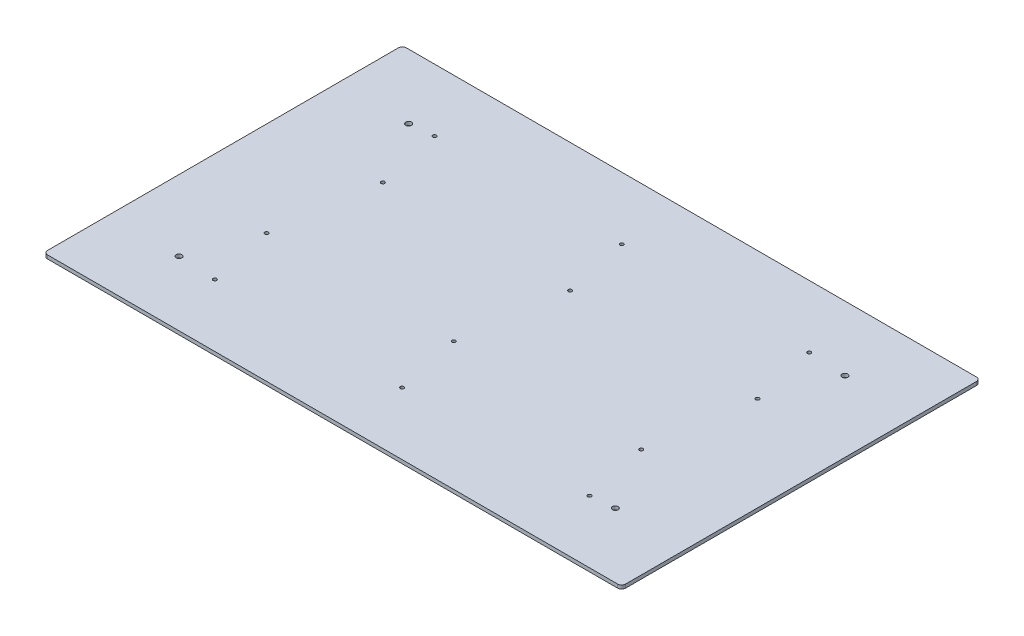
ISO-10303-21;
HEADER;
FILE_DESCRIPTION(('STEP AP214'),'2;1');
FILE_NAME('part.step','',(''),(''),'','','');
FILE_SCHEMA(('AUTOMOTIVE_DESIGN { 1 0 10303 214 1 1 1 1 }'));
ENDSEC;
DATA;
#1=APPLICATION_CONTEXT('core data for automotive mechanical design processes');
#2=APPLICATION_PROTOCOL_DEFINITION('international standard','automotive_design',2000,#1);
#3=PRODUCT_CONTEXT('',#1,'mechanical');
#4=PRODUCT('Part','Part','',(#3));
#5=PRODUCT_RELATED_PRODUCT_CATEGORY('part','',(#4));
#6=PRODUCT_DEFINITION_FORMATION('','',#4);
#7=PRODUCT_DEFINITION_CONTEXT('part definition',#1,'design');
#8=PRODUCT_DEFINITION('design','',#6,#7);
#9=PRODUCT_DEFINITION_SHAPE('','',#8);
#10=(LENGTH_UNIT() NAMED_UNIT(*) SI_UNIT(.MILLI.,.METRE.));
#11=(NAMED_UNIT(*) PLANE_ANGLE_UNIT() SI_UNIT($,.RADIAN.));
#12=(NAMED_UNIT(*) SI_UNIT($,.STERADIAN.) SOLID_ANGLE_UNIT());
#13=UNCERTAINTY_MEASURE_WITH_UNIT(LENGTH_MEASURE(1.E-05),#10,'distance_accuracy_value','');
#14=(GEOMETRIC_REPRESENTATION_CONTEXT(3) GLOBAL_UNCERTAINTY_ASSIGNED_CONTEXT((#13)) GLOBAL_UNIT_ASSIGNED_CONTEXT((#10,
#11,#12)) REPRESENTATION_CONTEXT('',''));
#15=CARTESIAN_POINT('',(0.,0.,0.));
#16=DIRECTION('',(0.,0.,1.));
#17=DIRECTION('',(1.,0.,0.));
#18=AXIS2_PLACEMENT_3D('',#15,#16,#17);
#19=CARTESIAN_POINT('',(184.15,2.286,114.3));
#20=DIRECTION('',(-1.,0.,0.));
#21=DIRECTION('',(0.,0.,1.));
#22=AXIS2_PLACEMENT_3D('',#19,#20,#21);
#23=PLANE('',#22);
#24=DIRECTION('',(0.,0.,-1.));
#25=VECTOR('',#24,1.);
#26=CARTESIAN_POINT('',(184.15,0.,114.3));
#27=LINE('',#26,#25);
#28=CARTESIAN_POINT('',(184.15,0.,111.76));
#29=VERTEX_POINT('',#28);
#30=CARTESIAN_POINT('',(184.15,0.,-111.76));
#31=VERTEX_POINT('',#30);
#32=EDGE_CURVE('E126',#29,#31,#27,.T.);
#33=ORIENTED_EDGE('',*,*,#32,.T.);
#34=DIRECTION('',(0.,-1.,0.));
#35=VECTOR('',#34,1.);
#36=CARTESIAN_POINT('',(184.15,2.286,-111.76));
#37=LINE('',#36,#35);
#38=CARTESIAN_POINT('',(184.15,2.286,-111.76));
#39=VERTEX_POINT('',#38);
#40=EDGE_CURVE('E104',#31,#39,#37,.F.);
#41=ORIENTED_EDGE('',*,*,#40,.T.);
#42=DIRECTION('',(0.,0.,-1.));
#43=VECTOR('',#42,1.);
#44=CARTESIAN_POINT('',(184.15,2.286,114.3));
#45=LINE('',#44,#43);
#46=CARTESIAN_POINT('',(184.15,2.286,111.76));
#47=VERTEX_POINT('',#46);
#48=EDGE_CURVE('E136',#47,#39,#45,.T.);
#49=ORIENTED_EDGE('',*,*,#48,.F.);
#50=DIRECTION('',(0.,-1.,0.));
#51=VECTOR('',#50,1.);
#52=CARTESIAN_POINT('',(184.15,2.286,111.76));
#53=LINE('',#52,#51);
#54=EDGE_CURVE('E109',#47,#29,#53,.T.);
#55=ORIENTED_EDGE('',*,*,#54,.T.);
#56=EDGE_LOOP('',(#33,#41,#49,#55));
#57=FACE_BOUND('',#56,.T.);
#58=ADVANCED_FACE('F33',(#57),#23,.F.);
#59=CARTESIAN_POINT('',(-184.15,2.286,-114.3));
#60=DIRECTION('',(0.,0.,1.));
#61=DIRECTION('',(1.,0.,0.));
#62=AXIS2_PLACEMENT_3D('',#59,#60,#61);
#63=PLANE('',#62);
#64=DIRECTION('',(-1.,0.,0.));
#65=VECTOR('',#64,1.);
#66=CARTESIAN_POINT('',(-184.15,2.286,-114.3));
#67=LINE('',#66,#65);
#68=CARTESIAN_POINT('',(181.61,2.286,-114.3));
#69=VERTEX_POINT('',#68);
#70=CARTESIAN_POINT('',(-181.61,2.286,-114.3));
#71=VERTEX_POINT('',#70);
#72=EDGE_CURVE('E119',#69,#71,#67,.T.);
#73=ORIENTED_EDGE('',*,*,#72,.F.);
#74=DIRECTION('',(0.,-1.,0.));
#75=VECTOR('',#74,1.);
#76=CARTESIAN_POINT('',(181.61,2.286,-114.3));
#77=LINE('',#76,#75);
#78=CARTESIAN_POINT('',(181.61,0.,-114.3));
#79=VERTEX_POINT('',#78);
#80=EDGE_CURVE('E103',#69,#79,#77,.T.);
#81=ORIENTED_EDGE('',*,*,#80,.T.);
#82=DIRECTION('',(-1.,0.,0.));
#83=VECTOR('',#82,1.);
#84=CARTESIAN_POINT('',(-184.15,0.,-114.3));
#85=LINE('',#84,#83);
#86=CARTESIAN_POINT('',(-181.61,0.,-114.3));
#87=VERTEX_POINT('',#86);
#88=EDGE_CURVE('E116',#79,#87,#85,.T.);
#89=ORIENTED_EDGE('',*,*,#88,.T.);
#90=DIRECTION('',(0.,-1.,0.));
#91=VECTOR('',#90,1.);
#92=CARTESIAN_POINT('',(-181.61,2.286,-114.3));
#93=LINE('',#92,#91);
#94=EDGE_CURVE('E121',#87,#71,#93,.F.);
#95=ORIENTED_EDGE('',*,*,#94,.T.);
#96=EDGE_LOOP('',(#73,#81,#89,#95));
#97=FACE_BOUND('',#96,.T.);
#98=ADVANCED_FACE('F115',(#97),#63,.F.);
#99=CARTESIAN_POINT('',(-184.15,2.286,114.3));
#100=DIRECTION('',(1.,0.,0.));
#101=DIRECTION('',(0.,0.,-1.));
#102=AXIS2_PLACEMENT_3D('',#99,#100,#101);
#103=PLANE('',#102);
#104=DIRECTION('',(0.,0.,1.));
#105=VECTOR('',#104,1.);
#106=CARTESIAN_POINT('',(-184.15,2.286,114.3));
#107=LINE('',#106,#105);
#108=CARTESIAN_POINT('',(-184.15,2.286,-111.76));
#109=VERTEX_POINT('',#108);
#110=CARTESIAN_POINT('',(-184.15,2.286,111.76));
#111=VERTEX_POINT('',#110);
#112=EDGE_CURVE('E162',#109,#111,#107,.T.);
#113=ORIENTED_EDGE('',*,*,#112,.F.);
#114=DIRECTION('',(0.,-1.,0.));
#115=VECTOR('',#114,1.);
#116=CARTESIAN_POINT('',(-184.15,2.286,-111.76));
#117=LINE('',#116,#115);
#118=CARTESIAN_POINT('',(-184.15,0.,-111.76));
#119=VERTEX_POINT('',#118);
#120=EDGE_CURVE('E155',#109,#119,#117,.T.);
#121=ORIENTED_EDGE('',*,*,#120,.T.);
#122=DIRECTION('',(0.,0.,1.));
#123=VECTOR('',#122,1.);
#124=CARTESIAN_POINT('',(-184.15,0.,114.3));
#125=LINE('',#124,#123);
#126=CARTESIAN_POINT('',(-184.15,0.,111.76));
#127=VERTEX_POINT('',#126);
#128=EDGE_CURVE('E125',#119,#127,#125,.T.);
#129=ORIENTED_EDGE('',*,*,#128,.T.);
#130=DIRECTION('',(0.,-1.,0.));
#131=VECTOR('',#130,1.);
#132=CARTESIAN_POINT('',(-184.15,2.286,111.76));
#133=LINE('',#132,#131);
#134=EDGE_CURVE('E153',#127,#111,#133,.F.);
#135=ORIENTED_EDGE('',*,*,#134,.T.);
#136=EDGE_LOOP('',(#113,#121,#129,#135));
#137=FACE_BOUND('',#136,.T.);
#138=ADVANCED_FACE('F160',(#137),#103,.F.);
#139=CARTESIAN_POINT('',(-184.15,2.286,114.3));
#140=DIRECTION('',(0.,0.,-1.));
#141=DIRECTION('',(-1.,0.,0.));
#142=AXIS2_PLACEMENT_3D('',#139,#140,#141);
#143=PLANE('',#142);
#144=DIRECTION('',(1.,0.,0.));
#145=VECTOR('',#144,1.);
#146=CARTESIAN_POINT('',(-184.15,2.286,114.3));
#147=LINE('',#146,#145);
#148=CARTESIAN_POINT('',(-181.61,2.286,114.3));
#149=VERTEX_POINT('',#148);
#150=CARTESIAN_POINT('',(181.61,2.286,114.3));
#151=VERTEX_POINT('',#150);
#152=EDGE_CURVE('E137',#149,#151,#147,.T.);
#153=ORIENTED_EDGE('',*,*,#152,.F.);
#154=DIRECTION('',(0.,-1.,0.));
#155=VECTOR('',#154,1.);
#156=CARTESIAN_POINT('',(-181.61,2.286,114.3));
#157=LINE('',#156,#155);
#158=CARTESIAN_POINT('',(-181.61,0.,114.3));
#159=VERTEX_POINT('',#158);
#160=EDGE_CURVE('E11',#149,#159,#157,.T.);
#161=ORIENTED_EDGE('',*,*,#160,.T.);
#162=DIRECTION('',(1.,0.,0.));
#163=VECTOR('',#162,1.);
#164=CARTESIAN_POINT('',(-184.15,0.,114.3));
#165=LINE('',#164,#163);
#166=CARTESIAN_POINT('',(181.61,0.,114.3));
#167=VERTEX_POINT('',#166);
#168=EDGE_CURVE('E129',#159,#167,#165,.T.);
#169=ORIENTED_EDGE('',*,*,#168,.T.);
#170=DIRECTION('',(0.,-1.,0.));
#171=VECTOR('',#170,1.);
#172=CARTESIAN_POINT('',(181.61,2.286,114.3));
#173=LINE('',#172,#171);
#174=EDGE_CURVE('E41',#167,#151,#173,.F.);
#175=ORIENTED_EDGE('',*,*,#174,.T.);
#176=EDGE_LOOP('',(#153,#161,#169,#175));
#177=FACE_BOUND('',#176,.T.);
#178=ADVANCED_FACE('F169',(#177),#143,.F.);
#179=CARTESIAN_POINT('',(0.,2.286,0.));
#180=DIRECTION('',(0.,-1.,0.));
#181=DIRECTION('',(0.,0.,-1.));
#182=AXIS2_PLACEMENT_3D('',#179,#180,#181);
#183=PLANE('',#182);
#184=CARTESIAN_POINT('',(114.847391595634,2.286,-74.5472899797417));
#185=DIRECTION('',(0.,-1.,0.));
#186=DIRECTION('',(0.,0.,-1.));
#187=AXIS2_PLACEMENT_3D('',#184,#185,#186);
#188=CIRCLE('',#187,1.1303);
#189=CARTESIAN_POINT('',(114.847391595634,2.286,-75.6775899797417));
#190=VERTEX_POINT('',#189);
#191=EDGE_CURVE('E265',#190,#190,#188,.T.);
#192=ORIENTED_EDGE('',*,*,#191,.T.);
#193=EDGE_LOOP('',(#192));
#194=FACE_BOUND('',#193,.T.);
#195=CARTESIAN_POINT('',(123.912608404368,2.286,-32.513710020254));
#196=DIRECTION('',(0.,-1.,0.));
#197=DIRECTION('',(0.,0.,-1.));
#198=AXIS2_PLACEMENT_3D('',#195,#196,#197);
#199=CIRCLE('',#198,1.1303);
#200=CARTESIAN_POINT('',(123.912608404368,2.286,-33.644010020254));
#201=VERTEX_POINT('',#200);
#202=EDGE_CURVE('E259',#201,#201,#199,.T.);
#203=ORIENTED_EDGE('',*,*,#202,.T.);
#204=EDGE_LOOP('',(#203));
#205=FACE_BOUND('',#204,.T.);
#206=CARTESIAN_POINT('',(-4.53260840436583,2.286,-74.5472899797425));
#207=DIRECTION('',(0.,-1.,0.));
#208=DIRECTION('',(0.,0.,-1.));
#209=AXIS2_PLACEMENT_3D('',#206,#207,#208);
#210=CIRCLE('',#209,1.1303);
#211=CARTESIAN_POINT('',(-4.53260840436583,2.286,-75.6775899797425));
#212=VERTEX_POINT('',#211);
#213=EDGE_CURVE('E253',#212,#212,#210,.T.);
#214=ORIENTED_EDGE('',*,*,#213,.T.);
#215=EDGE_LOOP('',(#214));
#216=FACE_BOUND('',#215,.T.);
#217=CARTESIAN_POINT('',(4.53260840436839,2.286,-32.5137100202548));
#218=DIRECTION('',(0.,-1.,0.));
#219=DIRECTION('',(0.,0.,-1.));
#220=AXIS2_PLACEMENT_3D('',#217,#218,#219);
#221=CIRCLE('',#220,1.1303);
#222=CARTESIAN_POINT('',(4.53260840436839,2.286,-33.6440100202548));
#223=VERTEX_POINT('',#222);
#224=EDGE_CURVE('E247',#223,#223,#221,.T.);
#225=ORIENTED_EDGE('',*,*,#224,.T.);
#226=EDGE_LOOP('',(#225));
#227=FACE_BOUND('',#226,.T.);
#228=CARTESIAN_POINT('',(-123.912608404366,2.286,-74.5472899797433));
#229=DIRECTION('',(0.,-1.,0.));
#230=DIRECTION('',(0.,0.,-1.));
#231=AXIS2_PLACEMENT_3D('',#228,#229,#230);
#232=CIRCLE('',#231,1.1303);
#233=CARTESIAN_POINT('',(-123.912608404366,2.286,-75.6775899797433));
#234=VERTEX_POINT('',#233);
#235=EDGE_CURVE('E241',#234,#234,#232,.T.);
#236=ORIENTED_EDGE('',*,*,#235,.T.);
#237=EDGE_LOOP('',(#236));
#238=FACE_BOUND('',#237,.T.);
#239=CARTESIAN_POINT('',(-114.847391595632,2.286,-32.5137100202557));
#240=DIRECTION('',(0.,-1.,0.));
#241=DIRECTION('',(0.,0.,-1.));
#242=AXIS2_PLACEMENT_3D('',#239,#240,#241);
#243=CIRCLE('',#242,1.1303);
#244=CARTESIAN_POINT('',(-114.847391595632,2.286,-33.6440100202557));
#245=VERTEX_POINT('',#244);
#246=EDGE_CURVE('E235',#245,#245,#243,.T.);
#247=ORIENTED_EDGE('',*,*,#246,.T.);
#248=EDGE_LOOP('',(#247));
#249=FACE_BOUND('',#248,.T.);
#250=CARTESIAN_POINT('',(-123.912608404366,2.286,32.5137100202574));
#251=DIRECTION('',(0.,-1.,0.));
#252=DIRECTION('',(0.,0.,-1.));
#253=AXIS2_PLACEMENT_3D('',#250,#251,#252);
#254=CIRCLE('',#253,1.1303);
#255=CARTESIAN_POINT('',(-123.912608404366,2.286,31.3834100202574));
#256=VERTEX_POINT('',#255);
#257=EDGE_CURVE('E229',#256,#256,#254,.T.);
#258=ORIENTED_EDGE('',*,*,#257,.T.);
#259=EDGE_LOOP('',(#258));
#260=FACE_BOUND('',#259,.T.);
#261=CARTESIAN_POINT('',(-114.847391595632,2.286,74.5472899797451));
#262=DIRECTION('',(0.,-1.,0.));
#263=DIRECTION('',(0.,0.,-1.));
#264=AXIS2_PLACEMENT_3D('',#261,#262,#263);
#265=CIRCLE('',#264,1.1303);
#266=CARTESIAN_POINT('',(-114.847391595632,2.286,73.4169899797451));
#267=VERTEX_POINT('',#266);
#268=EDGE_CURVE('E223',#267,#267,#265,.T.);
#269=ORIENTED_EDGE('',*,*,#268,.T.);
#270=EDGE_LOOP('',(#269));
#271=FACE_BOUND('',#270,.T.);
#272=CARTESIAN_POINT('',(-4.53260840436583,2.286,32.5137100202575));
#273=DIRECTION('',(0.,-1.,0.));
#274=DIRECTION('',(0.,0.,-1.));
#275=AXIS2_PLACEMENT_3D('',#272,#273,#274);
#276=CIRCLE('',#275,1.1303);
#277=CARTESIAN_POINT('',(-4.53260840436583,2.286,31.3834100202575));
#278=VERTEX_POINT('',#277);
#279=EDGE_CURVE('E217',#278,#278,#276,.T.);
#280=ORIENTED_EDGE('',*,*,#279,.T.);
#281=EDGE_LOOP('',(#280));
#282=FACE_BOUND('',#281,.T.);
#283=CARTESIAN_POINT('',(4.53260840436839,2.286,74.5472899797452));
#284=DIRECTION('',(0.,-1.,0.));
#285=DIRECTION('',(0.,0.,-1.));
#286=AXIS2_PLACEMENT_3D('',#283,#284,#285);
#287=CIRCLE('',#286,1.1303);
#288=CARTESIAN_POINT('',(4.53260840436839,2.286,73.4169899797452));
#289=VERTEX_POINT('',#288);
#290=EDGE_CURVE('E211',#289,#289,#287,.T.);
#291=ORIENTED_EDGE('',*,*,#290,.T.);
#292=EDGE_LOOP('',(#291));
#293=FACE_BOUND('',#292,.T.);
#294=CARTESIAN_POINT('',(114.847391595634,2.286,32.5137100202583));
#295=DIRECTION('',(0.,-1.,0.));
#296=DIRECTION('',(0.,0.,-1.));
#297=AXIS2_PLACEMENT_3D('',#294,#295,#296);
#298=CIRCLE('',#297,1.1303);
#299=CARTESIAN_POINT('',(114.847391595634,2.286,31.3834100202583));
#300=VERTEX_POINT('',#299);
#301=EDGE_CURVE('E205',#300,#300,#298,.T.);
#302=ORIENTED_EDGE('',*,*,#301,.T.);
#303=EDGE_LOOP('',(#302));
#304=FACE_BOUND('',#303,.T.);
#305=CARTESIAN_POINT('',(123.912608404368,2.286,74.547289979746));
#306=DIRECTION('',(0.,-1.,0.));
#307=DIRECTION('',(0.,0.,-1.));
#308=AXIS2_PLACEMENT_3D('',#305,#306,#307);
#309=CIRCLE('',#308,1.1303);
#310=CARTESIAN_POINT('',(123.912608404368,2.286,73.416989979746));
#311=VERTEX_POINT('',#310);
#312=EDGE_CURVE('E199',#311,#311,#309,.T.);
#313=ORIENTED_EDGE('',*,*,#312,.T.);
#314=EDGE_LOOP('',(#313));
#315=FACE_BOUND('',#314,.T.);
#316=CARTESIAN_POINT('',(139.001500000001,2.286,-73.152));
#317=DIRECTION('',(0.,-1.,0.));
#318=DIRECTION('',(0.,0.,-1.));
#319=AXIS2_PLACEMENT_3D('',#316,#317,#318);
#320=CIRCLE('',#319,1.82879999999999);
#321=CARTESIAN_POINT('',(139.001500000001,2.286,-74.9808));
#322=VERTEX_POINT('',#321);
#323=EDGE_CURVE('E193',#322,#322,#320,.T.);
#324=ORIENTED_EDGE('',*,*,#323,.T.);
#325=EDGE_LOOP('',(#324));
#326=FACE_BOUND('',#325,.T.);
#327=CARTESIAN_POINT('',(-139.001500000001,2.286,-73.152));
#328=DIRECTION('',(0.,-1.,0.));
#329=DIRECTION('',(0.,0.,-1.));
#330=AXIS2_PLACEMENT_3D('',#327,#328,#329);
#331=CIRCLE('',#330,1.82879999999999);
#332=CARTESIAN_POINT('',(-139.001500000001,2.286,-74.9808));
#333=VERTEX_POINT('',#332);
#334=EDGE_CURVE('E187',#333,#333,#331,.T.);
#335=ORIENTED_EDGE('',*,*,#334,.T.);
#336=EDGE_LOOP('',(#335));
#337=FACE_BOUND('',#336,.T.);
#338=CARTESIAN_POINT('',(-139.001500000001,2.286,73.152));
#339=DIRECTION('',(0.,-1.,0.));
#340=DIRECTION('',(0.,0.,-1.));
#341=AXIS2_PLACEMENT_3D('',#338,#339,#340);
#342=CIRCLE('',#341,1.82879999999999);
#343=CARTESIAN_POINT('',(-139.001500000001,2.286,71.3232));
#344=VERTEX_POINT('',#343);
#345=EDGE_CURVE('E181',#344,#344,#342,.T.);
#346=ORIENTED_EDGE('',*,*,#345,.T.);
#347=EDGE_LOOP('',(#346));
#348=FACE_BOUND('',#347,.T.);
#349=CARTESIAN_POINT('',(139.001500000001,2.286,73.152));
#350=DIRECTION('',(0.,-1.,0.));
#351=DIRECTION('',(0.,0.,-1.));
#352=AXIS2_PLACEMENT_3D('',#349,#350,#351);
#353=CIRCLE('',#352,1.82879999999999);
#354=CARTESIAN_POINT('',(139.001500000001,2.286,71.3232));
#355=VERTEX_POINT('',#354);
#356=EDGE_CURVE('E131',#355,#355,#353,.T.);
#357=ORIENTED_EDGE('',*,*,#356,.T.);
#358=EDGE_LOOP('',(#357));
#359=FACE_BOUND('',#358,.T.);
#360=ORIENTED_EDGE('',*,*,#48,.T.);
#361=CARTESIAN_POINT('',(181.61,2.286,-111.76));
#362=DIRECTION('',(0.,-1.,0.));
#363=DIRECTION('',(0.,0.,-1.));
#364=AXIS2_PLACEMENT_3D('',#361,#362,#363);
#365=CIRCLE('',#364,2.54);
#366=EDGE_CURVE('E151',#39,#69,#365,.F.);
#367=ORIENTED_EDGE('',*,*,#366,.T.);
#368=ORIENTED_EDGE('',*,*,#72,.T.);
#369=CARTESIAN_POINT('',(-181.61,2.286,-111.76));
#370=DIRECTION('',(0.,-1.,0.));
#371=DIRECTION('',(0.,0.,-1.));
#372=AXIS2_PLACEMENT_3D('',#369,#370,#371);
#373=CIRCLE('',#372,2.54);
#374=EDGE_CURVE('E149',#71,#109,#373,.F.);
#375=ORIENTED_EDGE('',*,*,#374,.T.);
#376=ORIENTED_EDGE('',*,*,#112,.T.);
#377=CARTESIAN_POINT('',(-181.61,2.286,111.76));
#378=DIRECTION('',(0.,-1.,0.));
#379=DIRECTION('',(0.,0.,-1.));
#380=AXIS2_PLACEMENT_3D('',#377,#378,#379);
#381=CIRCLE('',#380,2.54);
#382=EDGE_CURVE('E54',#111,#149,#381,.F.);
#383=ORIENTED_EDGE('',*,*,#382,.T.);
#384=ORIENTED_EDGE('',*,*,#152,.T.);
#385=CARTESIAN_POINT('',(181.61,2.286,111.76));
#386=DIRECTION('',(0.,-1.,0.));
#387=DIRECTION('',(0.,0.,-1.));
#388=AXIS2_PLACEMENT_3D('',#385,#386,#387);
#389=CIRCLE('',#388,2.54);
#390=EDGE_CURVE('E146',#151,#47,#389,.F.);
#391=ORIENTED_EDGE('',*,*,#390,.T.);
#392=EDGE_LOOP('',(#360,#367,#368,#375,#376,#383,#384,#391));
#393=FACE_BOUND('',#392,.T.);
#394=ADVANCED_FACE('F277',(#194,#205,#216,#227,#238,#249,#260,#271,#282,#293,#304,#315,#326,
#337,#348,#359,#393),#183,.F.);
#395=CARTESIAN_POINT('',(0.,0.,0.));
#396=DIRECTION('',(0.,-1.,0.));
#397=DIRECTION('',(0.,0.,-1.));
#398=AXIS2_PLACEMENT_3D('',#395,#396,#397);
#399=PLANE('',#398);
#400=CARTESIAN_POINT('',(114.847391595634,0.,-74.5472899797417));
#401=DIRECTION('',(0.,-1.,0.));
#402=DIRECTION('',(0.,0.,-1.));
#403=AXIS2_PLACEMENT_3D('',#400,#401,#402);
#404=CIRCLE('',#403,1.1303);
#405=CARTESIAN_POINT('',(114.847391595634,0.,-75.6775899797417));
#406=VERTEX_POINT('',#405);
#407=EDGE_CURVE('E268',#406,#406,#404,.T.);
#408=ORIENTED_EDGE('',*,*,#407,.F.);
#409=EDGE_LOOP('',(#408));
#410=FACE_BOUND('',#409,.T.);
#411=CARTESIAN_POINT('',(123.912608404368,0.,-32.513710020254));
#412=DIRECTION('',(0.,-1.,0.));
#413=DIRECTION('',(0.,0.,-1.));
#414=AXIS2_PLACEMENT_3D('',#411,#412,#413);
#415=CIRCLE('',#414,1.1303);
#416=CARTESIAN_POINT('',(123.912608404368,0.,-33.644010020254));
#417=VERTEX_POINT('',#416);
#418=EDGE_CURVE('E262',#417,#417,#415,.T.);
#419=ORIENTED_EDGE('',*,*,#418,.F.);
#420=EDGE_LOOP('',(#419));
#421=FACE_BOUND('',#420,.T.);
#422=CARTESIAN_POINT('',(-4.53260840436583,0.,-74.5472899797425));
#423=DIRECTION('',(0.,-1.,0.));
#424=DIRECTION('',(0.,0.,-1.));
#425=AXIS2_PLACEMENT_3D('',#422,#423,#424);
#426=CIRCLE('',#425,1.1303);
#427=CARTESIAN_POINT('',(-4.53260840436583,0.,-75.6775899797425));
#428=VERTEX_POINT('',#427);
#429=EDGE_CURVE('E256',#428,#428,#426,.T.);
#430=ORIENTED_EDGE('',*,*,#429,.F.);
#431=EDGE_LOOP('',(#430));
#432=FACE_BOUND('',#431,.T.);
#433=CARTESIAN_POINT('',(4.53260840436839,0.,-32.5137100202548));
#434=DIRECTION('',(0.,-1.,0.));
#435=DIRECTION('',(0.,0.,-1.));
#436=AXIS2_PLACEMENT_3D('',#433,#434,#435);
#437=CIRCLE('',#436,1.1303);
#438=CARTESIAN_POINT('',(4.53260840436839,0.,-33.6440100202548));
#439=VERTEX_POINT('',#438);
#440=EDGE_CURVE('E250',#439,#439,#437,.T.);
#441=ORIENTED_EDGE('',*,*,#440,.F.);
#442=EDGE_LOOP('',(#441));
#443=FACE_BOUND('',#442,.T.);
#444=CARTESIAN_POINT('',(-123.912608404366,0.,-74.5472899797433));
#445=DIRECTION('',(0.,-1.,0.));
#446=DIRECTION('',(0.,0.,-1.));
#447=AXIS2_PLACEMENT_3D('',#444,#445,#446);
#448=CIRCLE('',#447,1.1303);
#449=CARTESIAN_POINT('',(-123.912608404366,0.,-75.6775899797433));
#450=VERTEX_POINT('',#449);
#451=EDGE_CURVE('E244',#450,#450,#448,.T.);
#452=ORIENTED_EDGE('',*,*,#451,.F.);
#453=EDGE_LOOP('',(#452));
#454=FACE_BOUND('',#453,.T.);
#455=CARTESIAN_POINT('',(-114.847391595632,0.,-32.5137100202557));
#456=DIRECTION('',(0.,-1.,0.));
#457=DIRECTION('',(0.,0.,-1.));
#458=AXIS2_PLACEMENT_3D('',#455,#456,#457);
#459=CIRCLE('',#458,1.1303);
#460=CARTESIAN_POINT('',(-114.847391595632,0.,-33.6440100202557));
#461=VERTEX_POINT('',#460);
#462=EDGE_CURVE('E238',#461,#461,#459,.T.);
#463=ORIENTED_EDGE('',*,*,#462,.F.);
#464=EDGE_LOOP('',(#463));
#465=FACE_BOUND('',#464,.T.);
#466=CARTESIAN_POINT('',(-123.912608404366,0.,32.5137100202574));
#467=DIRECTION('',(0.,-1.,0.));
#468=DIRECTION('',(0.,0.,-1.));
#469=AXIS2_PLACEMENT_3D('',#466,#467,#468);
#470=CIRCLE('',#469,1.1303);
#471=CARTESIAN_POINT('',(-123.912608404366,0.,31.3834100202574));
#472=VERTEX_POINT('',#471);
#473=EDGE_CURVE('E232',#472,#472,#470,.T.);
#474=ORIENTED_EDGE('',*,*,#473,.F.);
#475=EDGE_LOOP('',(#474));
#476=FACE_BOUND('',#475,.T.);
#477=CARTESIAN_POINT('',(-114.847391595632,0.,74.5472899797451));
#478=DIRECTION('',(0.,-1.,0.));
#479=DIRECTION('',(0.,0.,-1.));
#480=AXIS2_PLACEMENT_3D('',#477,#478,#479);
#481=CIRCLE('',#480,1.1303);
#482=CARTESIAN_POINT('',(-114.847391595632,0.,73.4169899797451));
#483=VERTEX_POINT('',#482);
#484=EDGE_CURVE('E226',#483,#483,#481,.T.);
#485=ORIENTED_EDGE('',*,*,#484,.F.);
#486=EDGE_LOOP('',(#485));
#487=FACE_BOUND('',#486,.T.);
#488=CARTESIAN_POINT('',(-4.53260840436583,0.,32.5137100202575));
#489=DIRECTION('',(0.,-1.,0.));
#490=DIRECTION('',(0.,0.,-1.));
#491=AXIS2_PLACEMENT_3D('',#488,#489,#490);
#492=CIRCLE('',#491,1.1303);
#493=CARTESIAN_POINT('',(-4.53260840436583,0.,31.3834100202575));
#494=VERTEX_POINT('',#493);
#495=EDGE_CURVE('E220',#494,#494,#492,.T.);
#496=ORIENTED_EDGE('',*,*,#495,.F.);
#497=EDGE_LOOP('',(#496));
#498=FACE_BOUND('',#497,.T.);
#499=CARTESIAN_POINT('',(4.53260840436839,0.,74.5472899797452));
#500=DIRECTION('',(0.,-1.,0.));
#501=DIRECTION('',(0.,0.,-1.));
#502=AXIS2_PLACEMENT_3D('',#499,#500,#501);
#503=CIRCLE('',#502,1.1303);
#504=CARTESIAN_POINT('',(4.53260840436839,0.,73.4169899797452));
#505=VERTEX_POINT('',#504);
#506=EDGE_CURVE('E214',#505,#505,#503,.T.);
#507=ORIENTED_EDGE('',*,*,#506,.F.);
#508=EDGE_LOOP('',(#507));
#509=FACE_BOUND('',#508,.T.);
#510=CARTESIAN_POINT('',(114.847391595634,0.,32.5137100202583));
#511=DIRECTION('',(0.,-1.,0.));
#512=DIRECTION('',(0.,0.,-1.));
#513=AXIS2_PLACEMENT_3D('',#510,#511,#512);
#514=CIRCLE('',#513,1.1303);
#515=CARTESIAN_POINT('',(114.847391595634,0.,31.3834100202583));
#516=VERTEX_POINT('',#515);
#517=EDGE_CURVE('E208',#516,#516,#514,.T.);
#518=ORIENTED_EDGE('',*,*,#517,.F.);
#519=EDGE_LOOP('',(#518));
#520=FACE_BOUND('',#519,.T.);
#521=CARTESIAN_POINT('',(123.912608404368,0.,74.547289979746));
#522=DIRECTION('',(0.,-1.,0.));
#523=DIRECTION('',(0.,0.,-1.));
#524=AXIS2_PLACEMENT_3D('',#521,#522,#523);
#525=CIRCLE('',#524,1.1303);
#526=CARTESIAN_POINT('',(123.912608404368,0.,73.416989979746));
#527=VERTEX_POINT('',#526);
#528=EDGE_CURVE('E202',#527,#527,#525,.T.);
#529=ORIENTED_EDGE('',*,*,#528,.F.);
#530=EDGE_LOOP('',(#529));
#531=FACE_BOUND('',#530,.T.);
#532=CARTESIAN_POINT('',(139.001500000001,0.,-73.152));
#533=DIRECTION('',(0.,-1.,0.));
#534=DIRECTION('',(0.,0.,-1.));
#535=AXIS2_PLACEMENT_3D('',#532,#533,#534);
#536=CIRCLE('',#535,1.82879999999999);
#537=CARTESIAN_POINT('',(139.001500000001,0.,-74.9808));
#538=VERTEX_POINT('',#537);
#539=EDGE_CURVE('E196',#538,#538,#536,.T.);
#540=ORIENTED_EDGE('',*,*,#539,.F.);
#541=EDGE_LOOP('',(#540));
#542=FACE_BOUND('',#541,.T.);
#543=CARTESIAN_POINT('',(-139.001500000001,0.,-73.152));
#544=DIRECTION('',(0.,-1.,0.));
#545=DIRECTION('',(0.,0.,-1.));
#546=AXIS2_PLACEMENT_3D('',#543,#544,#545);
#547=CIRCLE('',#546,1.82879999999999);
#548=CARTESIAN_POINT('',(-139.001500000001,0.,-74.9808));
#549=VERTEX_POINT('',#548);
#550=EDGE_CURVE('E190',#549,#549,#547,.T.);
#551=ORIENTED_EDGE('',*,*,#550,.F.);
#552=EDGE_LOOP('',(#551));
#553=FACE_BOUND('',#552,.T.);
#554=CARTESIAN_POINT('',(-139.001500000001,0.,73.152));
#555=DIRECTION('',(0.,-1.,0.));
#556=DIRECTION('',(0.,0.,-1.));
#557=AXIS2_PLACEMENT_3D('',#554,#555,#556);
#558=CIRCLE('',#557,1.82879999999999);
#559=CARTESIAN_POINT('',(-139.001500000001,0.,71.3232));
#560=VERTEX_POINT('',#559);
#561=EDGE_CURVE('E184',#560,#560,#558,.T.);
#562=ORIENTED_EDGE('',*,*,#561,.F.);
#563=EDGE_LOOP('',(#562));
#564=FACE_BOUND('',#563,.T.);
#565=CARTESIAN_POINT('',(139.001500000001,0.,73.152));
#566=DIRECTION('',(0.,-1.,0.));
#567=DIRECTION('',(0.,0.,-1.));
#568=AXIS2_PLACEMENT_3D('',#565,#566,#567);
#569=CIRCLE('',#568,1.82879999999999);
#570=CARTESIAN_POINT('',(139.001500000001,0.,71.3232));
#571=VERTEX_POINT('',#570);
#572=EDGE_CURVE('E178',#571,#571,#569,.T.);
#573=ORIENTED_EDGE('',*,*,#572,.F.);
#574=EDGE_LOOP('',(#573));
#575=FACE_BOUND('',#574,.T.);
#576=ORIENTED_EDGE('',*,*,#88,.F.);
#577=CARTESIAN_POINT('',(181.61,0.,-111.76));
#578=DIRECTION('',(0.,-1.,0.));
#579=DIRECTION('',(0.,0.,-1.));
#580=AXIS2_PLACEMENT_3D('',#577,#578,#579);
#581=CIRCLE('',#580,2.54);
#582=EDGE_CURVE('E99',#79,#31,#581,.T.);
#583=ORIENTED_EDGE('',*,*,#582,.T.);
#584=ORIENTED_EDGE('',*,*,#32,.F.);
#585=CARTESIAN_POINT('',(181.61,0.,111.76));
#586=DIRECTION('',(0.,-1.,0.));
#587=DIRECTION('',(0.,0.,-1.));
#588=AXIS2_PLACEMENT_3D('',#585,#586,#587);
#589=CIRCLE('',#588,2.54);
#590=EDGE_CURVE('E120',#29,#167,#589,.T.);
#591=ORIENTED_EDGE('',*,*,#590,.T.);
#592=ORIENTED_EDGE('',*,*,#168,.F.);
#593=CARTESIAN_POINT('',(-181.61,0.,111.76));
#594=DIRECTION('',(0.,-1.,0.));
#595=DIRECTION('',(0.,0.,-1.));
#596=AXIS2_PLACEMENT_3D('',#593,#594,#595);
#597=CIRCLE('',#596,2.54);
#598=EDGE_CURVE('E140',#159,#127,#597,.T.);
#599=ORIENTED_EDGE('',*,*,#598,.T.);
#600=ORIENTED_EDGE('',*,*,#128,.F.);
#601=CARTESIAN_POINT('',(-181.61,0.,-111.76));
#602=DIRECTION('',(0.,-1.,0.));
#603=DIRECTION('',(0.,0.,-1.));
#604=AXIS2_PLACEMENT_3D('',#601,#602,#603);
#605=CIRCLE('',#604,2.54);
#606=EDGE_CURVE('E110',#119,#87,#605,.T.);
#607=ORIENTED_EDGE('',*,*,#606,.T.);
#608=EDGE_LOOP('',(#576,#583,#584,#591,#592,#599,#600,#607));
#609=FACE_BOUND('',#608,.T.);
#610=ADVANCED_FACE('F123',(#410,#421,#432,#443,#454,#465,#476,#487,#498,#509,#520,#531,#542,
#553,#564,#575,#609),#399,.T.);
#611=CARTESIAN_POINT('',(139.001500000001,0.,73.152));
#612=DIRECTION('',(0.,-1.,0.));
#613=DIRECTION('',(0.,0.,-1.));
#614=AXIS2_PLACEMENT_3D('',#611,#612,#613);
#615=CYLINDRICAL_SURFACE('',#614,1.82879999999999);
#616=ORIENTED_EDGE('',*,*,#356,.F.);
#617=EDGE_LOOP('',(#616));
#618=FACE_BOUND('',#617,.T.);
#619=ORIENTED_EDGE('',*,*,#572,.T.);
#620=EDGE_LOOP('',(#619));
#621=FACE_BOUND('',#620,.T.);
#622=ADVANCED_FACE('F276',(#618,#621),#615,.F.);
#623=CARTESIAN_POINT('',(-139.001500000001,0.,73.152));
#624=DIRECTION('',(0.,-1.,0.));
#625=DIRECTION('',(0.,0.,-1.));
#626=AXIS2_PLACEMENT_3D('',#623,#624,#625);
#627=CYLINDRICAL_SURFACE('',#626,1.82879999999999);
#628=ORIENTED_EDGE('',*,*,#345,.F.);
#629=EDGE_LOOP('',(#628));
#630=FACE_BOUND('',#629,.T.);
#631=ORIENTED_EDGE('',*,*,#561,.T.);
#632=EDGE_LOOP('',(#631));
#633=FACE_BOUND('',#632,.T.);
#634=ADVANCED_FACE('F310',(#630,#633),#627,.F.);
#635=CARTESIAN_POINT('',(-139.001500000001,0.,-73.152));
#636=DIRECTION('',(0.,-1.,0.));
#637=DIRECTION('',(0.,0.,-1.));
#638=AXIS2_PLACEMENT_3D('',#635,#636,#637);
#639=CYLINDRICAL_SURFACE('',#638,1.82879999999999);
#640=ORIENTED_EDGE('',*,*,#334,.F.);
#641=EDGE_LOOP('',(#640));
#642=FACE_BOUND('',#641,.T.);
#643=ORIENTED_EDGE('',*,*,#550,.T.);
#644=EDGE_LOOP('',(#643));
#645=FACE_BOUND('',#644,.T.);
#646=ADVANCED_FACE('F316',(#642,#645),#639,.F.);
#647=CARTESIAN_POINT('',(139.001500000001,0.,-73.152));
#648=DIRECTION('',(0.,-1.,0.));
#649=DIRECTION('',(0.,0.,-1.));
#650=AXIS2_PLACEMENT_3D('',#647,#648,#649);
#651=CYLINDRICAL_SURFACE('',#650,1.82879999999999);
#652=ORIENTED_EDGE('',*,*,#323,.F.);
#653=EDGE_LOOP('',(#652));
#654=FACE_BOUND('',#653,.T.);
#655=ORIENTED_EDGE('',*,*,#539,.T.);
#656=EDGE_LOOP('',(#655));
#657=FACE_BOUND('',#656,.T.);
#658=ADVANCED_FACE('F486',(#654,#657),#651,.F.);
#659=CARTESIAN_POINT('',(123.912608404368,0.,74.547289979746));
#660=DIRECTION('',(0.,-1.,0.));
#661=DIRECTION('',(0.,0.,-1.));
#662=AXIS2_PLACEMENT_3D('',#659,#660,#661);
#663=CYLINDRICAL_SURFACE('',#662,1.1303);
#664=ORIENTED_EDGE('',*,*,#312,.F.);
#665=EDGE_LOOP('',(#664));
#666=FACE_BOUND('',#665,.T.);
#667=ORIENTED_EDGE('',*,*,#528,.T.);
#668=EDGE_LOOP('',(#667));
#669=FACE_BOUND('',#668,.T.);
#670=ADVANCED_FACE('F478',(#666,#669),#663,.F.);
#671=CARTESIAN_POINT('',(114.847391595634,0.,32.5137100202583));
#672=DIRECTION('',(0.,-1.,0.));
#673=DIRECTION('',(0.,0.,-1.));
#674=AXIS2_PLACEMENT_3D('',#671,#672,#673);
#675=CYLINDRICAL_SURFACE('',#674,1.1303);
#676=ORIENTED_EDGE('',*,*,#301,.F.);
#677=EDGE_LOOP('',(#676));
#678=FACE_BOUND('',#677,.T.);
#679=ORIENTED_EDGE('',*,*,#517,.T.);
#680=EDGE_LOOP('',(#679));
#681=FACE_BOUND('',#680,.T.);
#682=ADVANCED_FACE('F470',(#678,#681),#675,.F.);
#683=CARTESIAN_POINT('',(4.53260840436839,0.,74.5472899797452));
#684=DIRECTION('',(0.,-1.,0.));
#685=DIRECTION('',(0.,0.,-1.));
#686=AXIS2_PLACEMENT_3D('',#683,#684,#685);
#687=CYLINDRICAL_SURFACE('',#686,1.1303);
#688=ORIENTED_EDGE('',*,*,#290,.F.);
#689=EDGE_LOOP('',(#688));
#690=FACE_BOUND('',#689,.T.);
#691=ORIENTED_EDGE('',*,*,#506,.T.);
#692=EDGE_LOOP('',(#691));
#693=FACE_BOUND('',#692,.T.);
#694=ADVANCED_FACE('F462',(#690,#693),#687,.F.);
#695=CARTESIAN_POINT('',(-4.53260840436583,0.,32.5137100202575));
#696=DIRECTION('',(0.,-1.,0.));
#697=DIRECTION('',(0.,0.,-1.));
#698=AXIS2_PLACEMENT_3D('',#695,#696,#697);
#699=CYLINDRICAL_SURFACE('',#698,1.1303);
#700=ORIENTED_EDGE('',*,*,#279,.F.);
#701=EDGE_LOOP('',(#700));
#702=FACE_BOUND('',#701,.T.);
#703=ORIENTED_EDGE('',*,*,#495,.T.);
#704=EDGE_LOOP('',(#703));
#705=FACE_BOUND('',#704,.T.);
#706=ADVANCED_FACE('F454',(#702,#705),#699,.F.);
#707=CARTESIAN_POINT('',(-114.847391595632,0.,74.5472899797451));
#708=DIRECTION('',(0.,-1.,0.));
#709=DIRECTION('',(0.,0.,-1.));
#710=AXIS2_PLACEMENT_3D('',#707,#708,#709);
#711=CYLINDRICAL_SURFACE('',#710,1.1303);
#712=ORIENTED_EDGE('',*,*,#268,.F.);
#713=EDGE_LOOP('',(#712));
#714=FACE_BOUND('',#713,.T.);
#715=ORIENTED_EDGE('',*,*,#484,.T.);
#716=EDGE_LOOP('',(#715));
#717=FACE_BOUND('',#716,.T.);
#718=ADVANCED_FACE('F446',(#714,#717),#711,.F.);
#719=CARTESIAN_POINT('',(-123.912608404366,0.,32.5137100202574));
#720=DIRECTION('',(0.,-1.,0.));
#721=DIRECTION('',(0.,0.,-1.));
#722=AXIS2_PLACEMENT_3D('',#719,#720,#721);
#723=CYLINDRICAL_SURFACE('',#722,1.1303);
#724=ORIENTED_EDGE('',*,*,#257,.F.);
#725=EDGE_LOOP('',(#724));
#726=FACE_BOUND('',#725,.T.);
#727=ORIENTED_EDGE('',*,*,#473,.T.);
#728=EDGE_LOOP('',(#727));
#729=FACE_BOUND('',#728,.T.);
#730=ADVANCED_FACE('F438',(#726,#729),#723,.F.);
#731=CARTESIAN_POINT('',(-114.847391595632,0.,-32.5137100202557));
#732=DIRECTION('',(0.,-1.,0.));
#733=DIRECTION('',(0.,0.,-1.));
#734=AXIS2_PLACEMENT_3D('',#731,#732,#733);
#735=CYLINDRICAL_SURFACE('',#734,1.1303);
#736=ORIENTED_EDGE('',*,*,#246,.F.);
#737=EDGE_LOOP('',(#736));
#738=FACE_BOUND('',#737,.T.);
#739=ORIENTED_EDGE('',*,*,#462,.T.);
#740=EDGE_LOOP('',(#739));
#741=FACE_BOUND('',#740,.T.);
#742=ADVANCED_FACE('F430',(#738,#741),#735,.F.);
#743=CARTESIAN_POINT('',(-123.912608404366,0.,-74.5472899797433));
#744=DIRECTION('',(0.,-1.,0.));
#745=DIRECTION('',(0.,0.,-1.));
#746=AXIS2_PLACEMENT_3D('',#743,#744,#745);
#747=CYLINDRICAL_SURFACE('',#746,1.1303);
#748=ORIENTED_EDGE('',*,*,#235,.F.);
#749=EDGE_LOOP('',(#748));
#750=FACE_BOUND('',#749,.T.);
#751=ORIENTED_EDGE('',*,*,#451,.T.);
#752=EDGE_LOOP('',(#751));
#753=FACE_BOUND('',#752,.T.);
#754=ADVANCED_FACE('F422',(#750,#753),#747,.F.);
#755=CARTESIAN_POINT('',(4.53260840436839,0.,-32.5137100202548));
#756=DIRECTION('',(0.,-1.,0.));
#757=DIRECTION('',(0.,0.,-1.));
#758=AXIS2_PLACEMENT_3D('',#755,#756,#757);
#759=CYLINDRICAL_SURFACE('',#758,1.1303);
#760=ORIENTED_EDGE('',*,*,#224,.F.);
#761=EDGE_LOOP('',(#760));
#762=FACE_BOUND('',#761,.T.);
#763=ORIENTED_EDGE('',*,*,#440,.T.);
#764=EDGE_LOOP('',(#763));
#765=FACE_BOUND('',#764,.T.);
#766=ADVANCED_FACE('F414',(#762,#765),#759,.F.);
#767=CARTESIAN_POINT('',(-4.53260840436583,0.,-74.5472899797425));
#768=DIRECTION('',(0.,-1.,0.));
#769=DIRECTION('',(0.,0.,-1.));
#770=AXIS2_PLACEMENT_3D('',#767,#768,#769);
#771=CYLINDRICAL_SURFACE('',#770,1.1303);
#772=ORIENTED_EDGE('',*,*,#213,.F.);
#773=EDGE_LOOP('',(#772));
#774=FACE_BOUND('',#773,.T.);
#775=ORIENTED_EDGE('',*,*,#429,.T.);
#776=EDGE_LOOP('',(#775));
#777=FACE_BOUND('',#776,.T.);
#778=ADVANCED_FACE('F406',(#774,#777),#771,.F.);
#779=CARTESIAN_POINT('',(123.912608404368,0.,-32.513710020254));
#780=DIRECTION('',(0.,-1.,0.));
#781=DIRECTION('',(0.,0.,-1.));
#782=AXIS2_PLACEMENT_3D('',#779,#780,#781);
#783=CYLINDRICAL_SURFACE('',#782,1.1303);
#784=ORIENTED_EDGE('',*,*,#202,.F.);
#785=EDGE_LOOP('',(#784));
#786=FACE_BOUND('',#785,.T.);
#787=ORIENTED_EDGE('',*,*,#418,.T.);
#788=EDGE_LOOP('',(#787));
#789=FACE_BOUND('',#788,.T.);
#790=ADVANCED_FACE('F399',(#786,#789),#783,.F.);
#791=CARTESIAN_POINT('',(114.847391595634,0.,-74.5472899797417));
#792=DIRECTION('',(0.,-1.,0.));
#793=DIRECTION('',(0.,0.,-1.));
#794=AXIS2_PLACEMENT_3D('',#791,#792,#793);
#795=CYLINDRICAL_SURFACE('',#794,1.1303);
#796=ORIENTED_EDGE('',*,*,#191,.F.);
#797=EDGE_LOOP('',(#796));
#798=FACE_BOUND('',#797,.T.);
#799=ORIENTED_EDGE('',*,*,#407,.T.);
#800=EDGE_LOOP('',(#799));
#801=FACE_BOUND('',#800,.T.);
#802=ADVANCED_FACE('F272',(#798,#801),#795,.F.);
#803=CARTESIAN_POINT('',(181.61,2.286,-111.76));
#804=DIRECTION('',(0.,-1.,0.));
#805=DIRECTION('',(0.,0.,-1.));
#806=AXIS2_PLACEMENT_3D('',#803,#804,#805);
#807=CYLINDRICAL_SURFACE('',#806,2.54);
#808=ORIENTED_EDGE('',*,*,#366,.F.);
#809=ORIENTED_EDGE('',*,*,#40,.F.);
#810=ORIENTED_EDGE('',*,*,#582,.F.);
#811=ORIENTED_EDGE('',*,*,#80,.F.);
#812=EDGE_LOOP('',(#808,#809,#810,#811));
#813=FACE_BOUND('',#812,.T.);
#814=ADVANCED_FACE('F102',(#813),#807,.T.);
#815=CARTESIAN_POINT('',(-181.61,2.286,-111.76));
#816=DIRECTION('',(0.,-1.,0.));
#817=DIRECTION('',(0.,0.,-1.));
#818=AXIS2_PLACEMENT_3D('',#815,#816,#817);
#819=CYLINDRICAL_SURFACE('',#818,2.54);
#820=ORIENTED_EDGE('',*,*,#374,.F.);
#821=ORIENTED_EDGE('',*,*,#94,.F.);
#822=ORIENTED_EDGE('',*,*,#606,.F.);
#823=ORIENTED_EDGE('',*,*,#120,.F.);
#824=EDGE_LOOP('',(#820,#821,#822,#823));
#825=FACE_BOUND('',#824,.T.);
#826=ADVANCED_FACE('F332',(#825),#819,.T.);
#827=CARTESIAN_POINT('',(-181.61,2.286,111.76));
#828=DIRECTION('',(0.,-1.,0.));
#829=DIRECTION('',(0.,0.,-1.));
#830=AXIS2_PLACEMENT_3D('',#827,#828,#829);
#831=CYLINDRICAL_SURFACE('',#830,2.54);
#832=ORIENTED_EDGE('',*,*,#382,.F.);
#833=ORIENTED_EDGE('',*,*,#134,.F.);
#834=ORIENTED_EDGE('',*,*,#598,.F.);
#835=ORIENTED_EDGE('',*,*,#160,.F.);
#836=EDGE_LOOP('',(#832,#833,#834,#835));
#837=FACE_BOUND('',#836,.T.);
#838=ADVANCED_FACE('F168',(#837),#831,.T.);
#839=CARTESIAN_POINT('',(181.61,2.286,111.76));
#840=DIRECTION('',(0.,-1.,0.));
#841=DIRECTION('',(0.,0.,-1.));
#842=AXIS2_PLACEMENT_3D('',#839,#840,#841);
#843=CYLINDRICAL_SURFACE('',#842,2.54);
#844=ORIENTED_EDGE('',*,*,#390,.F.);
#845=ORIENTED_EDGE('',*,*,#174,.F.);
#846=ORIENTED_EDGE('',*,*,#590,.F.);
#847=ORIENTED_EDGE('',*,*,#54,.F.);
#848=EDGE_LOOP('',(#844,#845,#846,#847));
#849=FACE_BOUND('',#848,.T.);
#850=ADVANCED_FACE('F35',(#849),#843,.T.);
#851=CLOSED_SHELL('',(#58,#98,#138,#178,#394,#610,#622,#634,#646,#658,#670,#682,#694,#706,#718,
#730,#742,#754,#766,#778,#790,#802,#814,#826,#838,#850));
#852=MANIFOLD_SOLID_BREP('B2',#851);
#853=ADVANCED_BREP_SHAPE_REPRESENTATION('',(#18,#852),#14);
#854=SHAPE_DEFINITION_REPRESENTATION(#9,#853);
ENDSEC;
END-ISO-10303-21;
